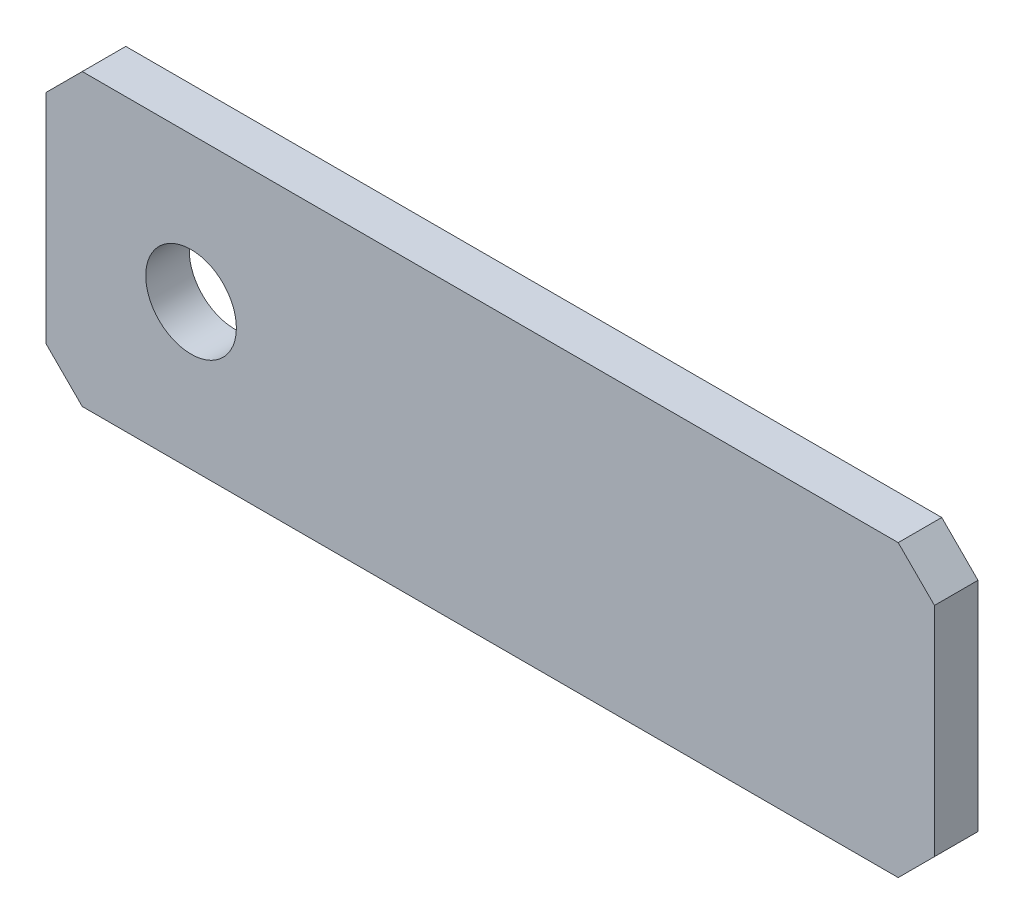
ISO-10303-21;
HEADER;
FILE_DESCRIPTION(('STEP AP214'),'2;1');
FILE_NAME('part.step','',(''),(''),'','','');
FILE_SCHEMA(('AUTOMOTIVE_DESIGN { 1 0 10303 214 1 1 1 1 }'));
ENDSEC;
DATA;
#1=APPLICATION_CONTEXT('core data for automotive mechanical design processes');
#2=APPLICATION_PROTOCOL_DEFINITION('international standard','automotive_design',2000,#1);
#3=PRODUCT_CONTEXT('',#1,'mechanical');
#4=PRODUCT('Part','Part','',(#3));
#5=PRODUCT_RELATED_PRODUCT_CATEGORY('part','',(#4));
#6=PRODUCT_DEFINITION_FORMATION('','',#4);
#7=PRODUCT_DEFINITION_CONTEXT('part definition',#1,'design');
#8=PRODUCT_DEFINITION('design','',#6,#7);
#9=PRODUCT_DEFINITION_SHAPE('','',#8);
#10=(LENGTH_UNIT() NAMED_UNIT(*) SI_UNIT(.MILLI.,.METRE.));
#11=(NAMED_UNIT(*) PLANE_ANGLE_UNIT() SI_UNIT($,.RADIAN.));
#12=(NAMED_UNIT(*) SI_UNIT($,.STERADIAN.) SOLID_ANGLE_UNIT());
#13=UNCERTAINTY_MEASURE_WITH_UNIT(LENGTH_MEASURE(1.E-05),#10,'distance_accuracy_value','');
#14=(GEOMETRIC_REPRESENTATION_CONTEXT(3) GLOBAL_UNCERTAINTY_ASSIGNED_CONTEXT((#13)) GLOBAL_UNIT_ASSIGNED_CONTEXT((#10,
#11,#12)) REPRESENTATION_CONTEXT('',''));
#15=CARTESIAN_POINT('',(0.,0.,0.));
#16=DIRECTION('',(0.,0.,1.));
#17=DIRECTION('',(1.,0.,0.));
#18=AXIS2_PLACEMENT_3D('',#15,#16,#17);
#19=CARTESIAN_POINT('',(0.,0.,1.2));
#20=DIRECTION('',(0.,0.,1.));
#21=DIRECTION('',(1.,0.,0.));
#22=AXIS2_PLACEMENT_3D('',#19,#20,#21);
#23=PLANE('',#22);
#24=DIRECTION('',(0.,-1.,0.));
#25=VECTOR('',#24,1.);
#26=CARTESIAN_POINT('',(-10.,23.5,1.2));
#27=LINE('',#26,#25);
#28=CARTESIAN_POINT('',(-10.,23.5,1.2));
#29=VERTEX_POINT('',#28);
#30=CARTESIAN_POINT('',(-10.,17.5,1.2));
#31=VERTEX_POINT('',#30);
#32=EDGE_CURVE('E177',#29,#31,#27,.T.);
#33=ORIENTED_EDGE('',*,*,#32,.T.);
#34=DIRECTION('',(0.707106781186547,-0.707106781186547,0.));
#35=VECTOR('',#34,1.);
#36=CARTESIAN_POINT('',(-10.,17.5,1.2));
#37=LINE('',#36,#35);
#38=CARTESIAN_POINT('',(-9.,16.5,1.2));
#39=VERTEX_POINT('',#38);
#40=EDGE_CURVE('E112',#31,#39,#37,.T.);
#41=ORIENTED_EDGE('',*,*,#40,.T.);
#42=DIRECTION('',(1.,0.,0.));
#43=VECTOR('',#42,1.);
#44=CARTESIAN_POINT('',(-9.,16.5,1.2));
#45=LINE('',#44,#43);
#46=CARTESIAN_POINT('',(13.5,16.5,1.2));
#47=VERTEX_POINT('',#46);
#48=EDGE_CURVE('E199',#39,#47,#45,.T.);
#49=ORIENTED_EDGE('',*,*,#48,.T.);
#50=DIRECTION('',(0.707106781186547,0.707106781186547,0.));
#51=VECTOR('',#50,1.);
#52=CARTESIAN_POINT('',(13.5,16.5,1.2));
#53=LINE('',#52,#51);
#54=CARTESIAN_POINT('',(14.5,17.5,1.2));
#55=VERTEX_POINT('',#54);
#56=EDGE_CURVE('E213',#47,#55,#53,.T.);
#57=ORIENTED_EDGE('',*,*,#56,.T.);
#58=DIRECTION('',(0.,1.,0.));
#59=VECTOR('',#58,1.);
#60=CARTESIAN_POINT('',(14.5,17.5,1.2));
#61=LINE('',#60,#59);
#62=CARTESIAN_POINT('',(14.5,23.5,1.2));
#63=VERTEX_POINT('',#62);
#64=EDGE_CURVE('E131',#55,#63,#61,.T.);
#65=ORIENTED_EDGE('',*,*,#64,.T.);
#66=DIRECTION('',(-0.707106781186547,0.707106781186547,0.));
#67=VECTOR('',#66,1.);
#68=CARTESIAN_POINT('',(14.5,23.5,1.2));
#69=LINE('',#68,#67);
#70=CARTESIAN_POINT('',(13.5,24.5,1.2));
#71=VERTEX_POINT('',#70);
#72=EDGE_CURVE('E125',#63,#71,#69,.T.);
#73=ORIENTED_EDGE('',*,*,#72,.T.);
#74=DIRECTION('',(-1.,0.,0.));
#75=VECTOR('',#74,1.);
#76=CARTESIAN_POINT('',(13.5,24.5,1.2));
#77=LINE('',#76,#75);
#78=CARTESIAN_POINT('',(-9.,24.5,1.2));
#79=VERTEX_POINT('',#78);
#80=EDGE_CURVE('E129',#71,#79,#77,.T.);
#81=ORIENTED_EDGE('',*,*,#80,.T.);
#82=DIRECTION('',(-0.707106781186547,-0.707106781186547,0.));
#83=VECTOR('',#82,1.);
#84=CARTESIAN_POINT('',(-9.,24.5,1.2));
#85=LINE('',#84,#83);
#86=EDGE_CURVE('E69',#79,#29,#85,.T.);
#87=ORIENTED_EDGE('',*,*,#86,.T.);
#88=EDGE_LOOP('',(#33,#41,#49,#57,#65,#73,#81,#87));
#89=FACE_BOUND('',#88,.T.);
#90=CARTESIAN_POINT('',(-6.00000000000001,20.5,1.2));
#91=DIRECTION('',(0.,0.,1.));
#92=DIRECTION('',(1.,0.,0.));
#93=AXIS2_PLACEMENT_3D('',#90,#91,#92);
#94=CIRCLE('',#93,1.25);
#95=CARTESIAN_POINT('',(-4.75000000000001,20.5,1.2));
#96=VERTEX_POINT('',#95);
#97=EDGE_CURVE('E159',#96,#96,#94,.T.);
#98=ORIENTED_EDGE('',*,*,#97,.F.);
#99=EDGE_LOOP('',(#98));
#100=FACE_BOUND('',#99,.T.);
#101=ADVANCED_FACE('F51',(#89,#100),#23,.T.);
#102=CARTESIAN_POINT('',(0.,0.,0.));
#103=DIRECTION('',(0.,0.,1.));
#104=DIRECTION('',(1.,0.,0.));
#105=AXIS2_PLACEMENT_3D('',#102,#103,#104);
#106=PLANE('',#105);
#107=DIRECTION('',(0.,-1.,0.));
#108=VECTOR('',#107,1.);
#109=CARTESIAN_POINT('',(-10.,23.5,0.));
#110=LINE('',#109,#108);
#111=CARTESIAN_POINT('',(-10.,23.5,0.));
#112=VERTEX_POINT('',#111);
#113=CARTESIAN_POINT('',(-10.,17.5,0.));
#114=VERTEX_POINT('',#113);
#115=EDGE_CURVE('E154',#112,#114,#110,.T.);
#116=ORIENTED_EDGE('',*,*,#115,.F.);
#117=DIRECTION('',(-0.707106781186547,-0.707106781186547,0.));
#118=VECTOR('',#117,1.);
#119=CARTESIAN_POINT('',(-9.,24.5,0.));
#120=LINE('',#119,#118);
#121=CARTESIAN_POINT('',(-9.,24.5,0.));
#122=VERTEX_POINT('',#121);
#123=EDGE_CURVE('E104',#122,#112,#120,.T.);
#124=ORIENTED_EDGE('',*,*,#123,.F.);
#125=DIRECTION('',(-1.,0.,0.));
#126=VECTOR('',#125,1.);
#127=CARTESIAN_POINT('',(13.5,24.5,0.));
#128=LINE('',#127,#126);
#129=CARTESIAN_POINT('',(13.5,24.5,0.));
#130=VERTEX_POINT('',#129);
#131=EDGE_CURVE('E98',#130,#122,#128,.T.);
#132=ORIENTED_EDGE('',*,*,#131,.F.);
#133=DIRECTION('',(-0.707106781186547,0.707106781186547,0.));
#134=VECTOR('',#133,1.);
#135=CARTESIAN_POINT('',(14.5,23.5,0.));
#136=LINE('',#135,#134);
#137=CARTESIAN_POINT('',(14.5,23.5,0.));
#138=VERTEX_POINT('',#137);
#139=EDGE_CURVE('E140',#138,#130,#136,.T.);
#140=ORIENTED_EDGE('',*,*,#139,.F.);
#141=DIRECTION('',(0.,1.,0.));
#142=VECTOR('',#141,1.);
#143=CARTESIAN_POINT('',(14.5,17.5,0.));
#144=LINE('',#143,#142);
#145=CARTESIAN_POINT('',(14.5,17.5,0.));
#146=VERTEX_POINT('',#145);
#147=EDGE_CURVE('E168',#146,#138,#144,.T.);
#148=ORIENTED_EDGE('',*,*,#147,.F.);
#149=DIRECTION('',(0.707106781186547,0.707106781186547,0.));
#150=VECTOR('',#149,1.);
#151=CARTESIAN_POINT('',(13.5,16.5,0.));
#152=LINE('',#151,#150);
#153=CARTESIAN_POINT('',(13.5,16.5,0.));
#154=VERTEX_POINT('',#153);
#155=EDGE_CURVE('E165',#154,#146,#152,.T.);
#156=ORIENTED_EDGE('',*,*,#155,.F.);
#157=DIRECTION('',(1.,0.,0.));
#158=VECTOR('',#157,1.);
#159=CARTESIAN_POINT('',(-9.,16.5,0.));
#160=LINE('',#159,#158);
#161=CARTESIAN_POINT('',(-9.,16.5,0.));
#162=VERTEX_POINT('',#161);
#163=EDGE_CURVE('E162',#162,#154,#160,.T.);
#164=ORIENTED_EDGE('',*,*,#163,.F.);
#165=DIRECTION('',(0.707106781186547,-0.707106781186547,0.));
#166=VECTOR('',#165,1.);
#167=CARTESIAN_POINT('',(-10.,17.5,0.));
#168=LINE('',#167,#166);
#169=EDGE_CURVE('E158',#114,#162,#168,.T.);
#170=ORIENTED_EDGE('',*,*,#169,.F.);
#171=EDGE_LOOP('',(#116,#124,#132,#140,#148,#156,#164,#170));
#172=FACE_BOUND('',#171,.T.);
#173=CARTESIAN_POINT('',(-6.00000000000001,20.5,0.));
#174=DIRECTION('',(0.,0.,1.));
#175=DIRECTION('',(1.,0.,0.));
#176=AXIS2_PLACEMENT_3D('',#173,#174,#175);
#177=CIRCLE('',#176,1.25);
#178=CARTESIAN_POINT('',(-4.75000000000001,20.5,0.));
#179=VERTEX_POINT('',#178);
#180=EDGE_CURVE('E224',#179,#179,#177,.T.);
#181=ORIENTED_EDGE('',*,*,#180,.T.);
#182=EDGE_LOOP('',(#181));
#183=FACE_BOUND('',#182,.T.);
#184=ADVANCED_FACE('F203',(#172,#183),#106,.F.);
#185=CARTESIAN_POINT('',(-10.,23.5,1.2));
#186=DIRECTION('',(1.,0.,0.));
#187=DIRECTION('',(0.,0.,-1.));
#188=AXIS2_PLACEMENT_3D('',#185,#186,#187);
#189=PLANE('',#188);
#190=ORIENTED_EDGE('',*,*,#115,.T.);
#191=DIRECTION('',(0.,0.,-1.));
#192=VECTOR('',#191,1.);
#193=CARTESIAN_POINT('',(-10.,17.5,1.2));
#194=LINE('',#193,#192);
#195=EDGE_CURVE('E11',#31,#114,#194,.T.);
#196=ORIENTED_EDGE('',*,*,#195,.F.);
#197=ORIENTED_EDGE('',*,*,#32,.F.);
#198=DIRECTION('',(0.,0.,-1.));
#199=VECTOR('',#198,1.);
#200=CARTESIAN_POINT('',(-10.,23.5,1.2));
#201=LINE('',#200,#199);
#202=EDGE_CURVE('E150',#29,#112,#201,.T.);
#203=ORIENTED_EDGE('',*,*,#202,.T.);
#204=EDGE_LOOP('',(#190,#196,#197,#203));
#205=FACE_BOUND('',#204,.T.);
#206=ADVANCED_FACE('F53',(#205),#189,.F.);
#207=CARTESIAN_POINT('',(-10.,17.5,1.2));
#208=DIRECTION('',(0.707106781186547,0.707106781186547,0.));
#209=DIRECTION('',(-0.707106781186548,0.707106781186548,0.));
#210=AXIS2_PLACEMENT_3D('',#207,#208,#209);
#211=PLANE('',#210);
#212=ORIENTED_EDGE('',*,*,#169,.T.);
#213=DIRECTION('',(0.,0.,-1.));
#214=VECTOR('',#213,1.);
#215=CARTESIAN_POINT('',(-9.,16.5,1.2));
#216=LINE('',#215,#214);
#217=EDGE_CURVE('E61',#39,#162,#216,.T.);
#218=ORIENTED_EDGE('',*,*,#217,.F.);
#219=ORIENTED_EDGE('',*,*,#40,.F.);
#220=ORIENTED_EDGE('',*,*,#195,.T.);
#221=EDGE_LOOP('',(#212,#218,#219,#220));
#222=FACE_BOUND('',#221,.T.);
#223=ADVANCED_FACE('F255',(#222),#211,.F.);
#224=CARTESIAN_POINT('',(-9.,16.5,1.2));
#225=DIRECTION('',(0.,1.,0.));
#226=DIRECTION('',(0.,0.,1.));
#227=AXIS2_PLACEMENT_3D('',#224,#225,#226);
#228=PLANE('',#227);
#229=ORIENTED_EDGE('',*,*,#163,.T.);
#230=DIRECTION('',(0.,0.,-1.));
#231=VECTOR('',#230,1.);
#232=CARTESIAN_POINT('',(13.5,16.5,1.2));
#233=LINE('',#232,#231);
#234=EDGE_CURVE('E188',#47,#154,#233,.T.);
#235=ORIENTED_EDGE('',*,*,#234,.F.);
#236=ORIENTED_EDGE('',*,*,#48,.F.);
#237=ORIENTED_EDGE('',*,*,#217,.T.);
#238=EDGE_LOOP('',(#229,#235,#236,#237));
#239=FACE_BOUND('',#238,.T.);
#240=ADVANCED_FACE('F197',(#239),#228,.F.);
#241=CARTESIAN_POINT('',(13.5,16.5,1.2));
#242=DIRECTION('',(-0.707106781186547,0.707106781186547,0.));
#243=DIRECTION('',(-0.707106781186548,-0.707106781186548,0.));
#244=AXIS2_PLACEMENT_3D('',#241,#242,#243);
#245=PLANE('',#244);
#246=ORIENTED_EDGE('',*,*,#155,.T.);
#247=DIRECTION('',(0.,0.,-1.));
#248=VECTOR('',#247,1.);
#249=CARTESIAN_POINT('',(14.5,17.5,1.2));
#250=LINE('',#249,#248);
#251=EDGE_CURVE('E184',#55,#146,#250,.T.);
#252=ORIENTED_EDGE('',*,*,#251,.F.);
#253=ORIENTED_EDGE('',*,*,#56,.F.);
#254=ORIENTED_EDGE('',*,*,#234,.T.);
#255=EDGE_LOOP('',(#246,#252,#253,#254));
#256=FACE_BOUND('',#255,.T.);
#257=ADVANCED_FACE('F208',(#256),#245,.F.);
#258=CARTESIAN_POINT('',(14.5,17.5,1.2));
#259=DIRECTION('',(-1.,0.,0.));
#260=DIRECTION('',(0.,0.,1.));
#261=AXIS2_PLACEMENT_3D('',#258,#259,#260);
#262=PLANE('',#261);
#263=ORIENTED_EDGE('',*,*,#147,.T.);
#264=DIRECTION('',(0.,0.,-1.));
#265=VECTOR('',#264,1.);
#266=CARTESIAN_POINT('',(14.5,23.5,1.2));
#267=LINE('',#266,#265);
#268=EDGE_CURVE('E142',#63,#138,#267,.T.);
#269=ORIENTED_EDGE('',*,*,#268,.F.);
#270=ORIENTED_EDGE('',*,*,#64,.F.);
#271=ORIENTED_EDGE('',*,*,#251,.T.);
#272=EDGE_LOOP('',(#263,#269,#270,#271));
#273=FACE_BOUND('',#272,.T.);
#274=ADVANCED_FACE('F211',(#273),#262,.F.);
#275=CARTESIAN_POINT('',(14.5,23.5,1.2));
#276=DIRECTION('',(-0.707106781186547,-0.707106781186547,0.));
#277=DIRECTION('',(0.707106781186548,-0.707106781186548,0.));
#278=AXIS2_PLACEMENT_3D('',#275,#276,#277);
#279=PLANE('',#278);
#280=ORIENTED_EDGE('',*,*,#139,.T.);
#281=DIRECTION('',(0.,0.,-1.));
#282=VECTOR('',#281,1.);
#283=CARTESIAN_POINT('',(13.5,24.5,1.2));
#284=LINE('',#283,#282);
#285=EDGE_CURVE('E137',#71,#130,#284,.T.);
#286=ORIENTED_EDGE('',*,*,#285,.F.);
#287=ORIENTED_EDGE('',*,*,#72,.F.);
#288=ORIENTED_EDGE('',*,*,#268,.T.);
#289=EDGE_LOOP('',(#280,#286,#287,#288));
#290=FACE_BOUND('',#289,.T.);
#291=ADVANCED_FACE('F138',(#290),#279,.F.);
#292=CARTESIAN_POINT('',(13.5,24.5,1.2));
#293=DIRECTION('',(0.,-1.,0.));
#294=DIRECTION('',(0.,0.,-1.));
#295=AXIS2_PLACEMENT_3D('',#292,#293,#294);
#296=PLANE('',#295);
#297=ORIENTED_EDGE('',*,*,#131,.T.);
#298=DIRECTION('',(0.,0.,-1.));
#299=VECTOR('',#298,1.);
#300=CARTESIAN_POINT('',(-9.,24.5,1.2));
#301=LINE('',#300,#299);
#302=EDGE_CURVE('E143',#79,#122,#301,.T.);
#303=ORIENTED_EDGE('',*,*,#302,.F.);
#304=ORIENTED_EDGE('',*,*,#80,.F.);
#305=ORIENTED_EDGE('',*,*,#285,.T.);
#306=EDGE_LOOP('',(#297,#303,#304,#305));
#307=FACE_BOUND('',#306,.T.);
#308=ADVANCED_FACE('F145',(#307),#296,.F.);
#309=CARTESIAN_POINT('',(-9.,24.5,1.2));
#310=DIRECTION('',(0.707106781186547,-0.707106781186547,0.));
#311=DIRECTION('',(0.707106781186548,0.707106781186548,0.));
#312=AXIS2_PLACEMENT_3D('',#309,#310,#311);
#313=PLANE('',#312);
#314=ORIENTED_EDGE('',*,*,#123,.T.);
#315=ORIENTED_EDGE('',*,*,#202,.F.);
#316=ORIENTED_EDGE('',*,*,#86,.F.);
#317=ORIENTED_EDGE('',*,*,#302,.T.);
#318=EDGE_LOOP('',(#314,#315,#316,#317));
#319=FACE_BOUND('',#318,.T.);
#320=ADVANCED_FACE('F243',(#319),#313,.F.);
#321=CARTESIAN_POINT('',(-6.00000000000001,20.5,1.2));
#322=DIRECTION('',(0.,0.,-1.));
#323=DIRECTION('',(-1.,0.,0.));
#324=AXIS2_PLACEMENT_3D('',#321,#322,#323);
#325=CYLINDRICAL_SURFACE('',#324,1.25);
#326=ORIENTED_EDGE('',*,*,#97,.T.);
#327=EDGE_LOOP('',(#326));
#328=FACE_BOUND('',#327,.T.);
#329=ORIENTED_EDGE('',*,*,#180,.F.);
#330=EDGE_LOOP('',(#329));
#331=FACE_BOUND('',#330,.T.);
#332=ADVANCED_FACE('F233',(#328,#331),#325,.F.);
#333=CLOSED_SHELL('',(#101,#184,#206,#223,#240,#257,#274,#291,#308,#320,#332));
#334=MANIFOLD_SOLID_BREP('B2',#333);
#335=ADVANCED_BREP_SHAPE_REPRESENTATION('',(#18,#334),#14);
#336=SHAPE_DEFINITION_REPRESENTATION(#9,#335);
ENDSEC;
END-ISO-10303-21;
